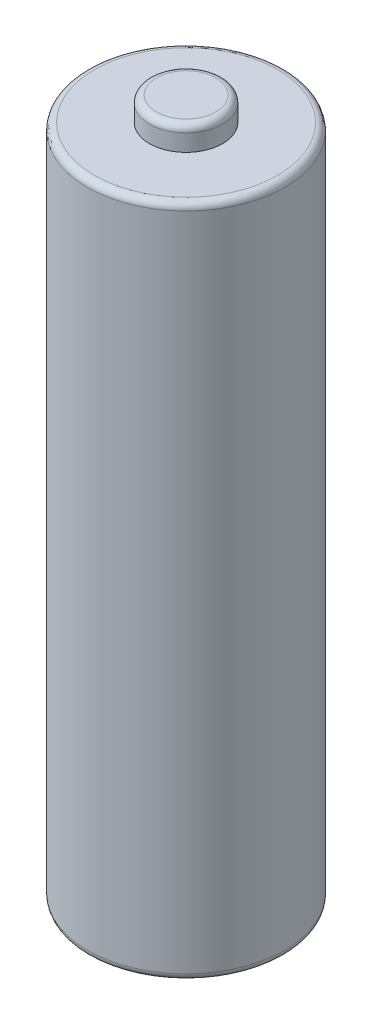
ISO-10303-21;
HEADER;
FILE_DESCRIPTION(('STEP AP214'),'2;1');
FILE_NAME('part.step','',(''),(''),'','','');
FILE_SCHEMA(('AUTOMOTIVE_DESIGN { 1 0 10303 214 1 1 1 1 }'));
ENDSEC;
DATA;
#1=APPLICATION_CONTEXT('core data for automotive mechanical design processes');
#2=APPLICATION_PROTOCOL_DEFINITION('international standard','automotive_design',2000,#1);
#3=PRODUCT_CONTEXT('',#1,'mechanical');
#4=PRODUCT('Part','Part','',(#3));
#5=PRODUCT_RELATED_PRODUCT_CATEGORY('part','',(#4));
#6=PRODUCT_DEFINITION_FORMATION('','',#4);
#7=PRODUCT_DEFINITION_CONTEXT('part definition',#1,'design');
#8=PRODUCT_DEFINITION('design','',#6,#7);
#9=PRODUCT_DEFINITION_SHAPE('','',#8);
#10=(LENGTH_UNIT() NAMED_UNIT(*) SI_UNIT(.MILLI.,.METRE.));
#11=(NAMED_UNIT(*) PLANE_ANGLE_UNIT() SI_UNIT($,.RADIAN.));
#12=(NAMED_UNIT(*) SI_UNIT($,.STERADIAN.) SOLID_ANGLE_UNIT());
#13=UNCERTAINTY_MEASURE_WITH_UNIT(LENGTH_MEASURE(1.E-05),#10,'distance_accuracy_value','');
#14=(GEOMETRIC_REPRESENTATION_CONTEXT(3) GLOBAL_UNCERTAINTY_ASSIGNED_CONTEXT((#13)) GLOBAL_UNIT_ASSIGNED_CONTEXT((#10,
#11,#12)) REPRESENTATION_CONTEXT('',''));
#15=CARTESIAN_POINT('',(0.,0.,0.));
#16=DIRECTION('',(0.,0.,1.));
#17=DIRECTION('',(1.,0.,0.));
#18=AXIS2_PLACEMENT_3D('',#15,#16,#17);
#19=CARTESIAN_POINT('',(0.,48.25,0.));
#20=DIRECTION('',(0.,1.,0.));
#21=DIRECTION('',(0.,0.,1.));
#22=AXIS2_PLACEMENT_3D('',#19,#20,#21);
#23=PLANE('',#22);
#24=CARTESIAN_POINT('',(0.,48.25,0.));
#25=DIRECTION('',(0.,1.,0.));
#26=DIRECTION('',(0.,0.,1.));
#27=AXIS2_PLACEMENT_3D('',#24,#25,#26);
#28=CIRCLE('',#27,6.55);
#29=CARTESIAN_POINT('',(0.,48.25,6.55));
#30=VERTEX_POINT('',#29);
#31=EDGE_CURVE('E10',#30,#30,#28,.T.);
#32=ORIENTED_EDGE('',*,*,#31,.T.);
#33=EDGE_LOOP('',(#32));
#34=FACE_BOUND('',#33,.T.);
#35=CARTESIAN_POINT('',(0.,48.25,0.));
#36=DIRECTION('',(0.,1.,0.));
#37=DIRECTION('',(0.,0.,1.));
#38=AXIS2_PLACEMENT_3D('',#35,#36,#37);
#39=CIRCLE('',#38,2.62);
#40=CARTESIAN_POINT('',(0.,48.25,2.62));
#41=VERTEX_POINT('',#40);
#42=EDGE_CURVE('E57',#41,#41,#39,.T.);
#43=ORIENTED_EDGE('',*,*,#42,.F.);
#44=EDGE_LOOP('',(#43));
#45=FACE_BOUND('',#44,.T.);
#46=ADVANCED_FACE('F31',(#34,#45),#23,.T.);
#47=CARTESIAN_POINT('',(0.,48.25,0.));
#48=DIRECTION('',(0.,-1.,0.));
#49=DIRECTION('',(0.,0.,-1.));
#50=AXIS2_PLACEMENT_3D('',#47,#48,#49);
#51=CYLINDRICAL_SURFACE('',#50,7.05);
#52=CARTESIAN_POINT('',(0.,0.5,0.));
#53=DIRECTION('',(0.,1.,0.));
#54=DIRECTION('',(0.,0.,1.));
#55=AXIS2_PLACEMENT_3D('',#52,#53,#54);
#56=CIRCLE('',#55,7.05);
#57=CARTESIAN_POINT('',(0.,0.5,7.05));
#58=VERTEX_POINT('',#57);
#59=EDGE_CURVE('E42',#58,#58,#56,.T.);
#60=ORIENTED_EDGE('',*,*,#59,.T.);
#61=EDGE_LOOP('',(#60));
#62=FACE_BOUND('',#61,.T.);
#63=CARTESIAN_POINT('',(0.,47.75,0.));
#64=DIRECTION('',(0.,1.,0.));
#65=DIRECTION('',(0.,0.,1.));
#66=AXIS2_PLACEMENT_3D('',#63,#64,#65);
#67=CIRCLE('',#66,7.05);
#68=CARTESIAN_POINT('',(0.,47.75,7.05));
#69=VERTEX_POINT('',#68);
#70=EDGE_CURVE('E46',#69,#69,#67,.F.);
#71=ORIENTED_EDGE('',*,*,#70,.T.);
#72=EDGE_LOOP('',(#71));
#73=FACE_BOUND('',#72,.T.);
#74=ADVANCED_FACE('F64',(#62,#73),#51,.T.);
#75=CARTESIAN_POINT('',(0.,0.,0.));
#76=DIRECTION('',(0.,1.,0.));
#77=DIRECTION('',(0.,0.,1.));
#78=AXIS2_PLACEMENT_3D('',#75,#76,#77);
#79=PLANE('',#78);
#80=CARTESIAN_POINT('',(0.,0.,0.));
#81=DIRECTION('',(0.,1.,0.));
#82=DIRECTION('',(0.,0.,1.));
#83=AXIS2_PLACEMENT_3D('',#80,#81,#82);
#84=CIRCLE('',#83,6.55);
#85=CARTESIAN_POINT('',(0.,0.,6.55));
#86=VERTEX_POINT('',#85);
#87=EDGE_CURVE('E38',#86,#86,#84,.F.);
#88=ORIENTED_EDGE('',*,*,#87,.T.);
#89=EDGE_LOOP('',(#88));
#90=FACE_BOUND('',#89,.T.);
#91=ADVANCED_FACE('F69',(#90),#79,.F.);
#92=CARTESIAN_POINT('',(0.,49.96,0.));
#93=DIRECTION('',(0.,-1.,0.));
#94=DIRECTION('',(0.,0.,-1.));
#95=AXIS2_PLACEMENT_3D('',#92,#93,#94);
#96=CYLINDRICAL_SURFACE('',#95,2.62);
#97=CARTESIAN_POINT('',(0.,49.46,0.));
#98=DIRECTION('',(0.,1.,0.));
#99=DIRECTION('',(0.,0.,1.));
#100=AXIS2_PLACEMENT_3D('',#97,#98,#99);
#101=CIRCLE('',#100,2.62);
#102=CARTESIAN_POINT('',(0.,49.46,2.62));
#103=VERTEX_POINT('',#102);
#104=EDGE_CURVE('E51',#103,#103,#101,.F.);
#105=ORIENTED_EDGE('',*,*,#104,.T.);
#106=EDGE_LOOP('',(#105));
#107=FACE_BOUND('',#106,.T.);
#108=ORIENTED_EDGE('',*,*,#42,.T.);
#109=EDGE_LOOP('',(#108));
#110=FACE_BOUND('',#109,.T.);
#111=ADVANCED_FACE('F61',(#107,#110),#96,.T.);
#112=CARTESIAN_POINT('',(0.,49.96,0.));
#113=DIRECTION('',(0.,1.,0.));
#114=DIRECTION('',(0.,0.,1.));
#115=AXIS2_PLACEMENT_3D('',#112,#113,#114);
#116=PLANE('',#115);
#117=CARTESIAN_POINT('',(0.,49.96,0.));
#118=DIRECTION('',(0.,1.,0.));
#119=DIRECTION('',(0.,0.,1.));
#120=AXIS2_PLACEMENT_3D('',#117,#118,#119);
#121=CIRCLE('',#120,2.12);
#122=CARTESIAN_POINT('',(0.,49.96,2.12));
#123=VERTEX_POINT('',#122);
#124=EDGE_CURVE('E54',#123,#123,#121,.T.);
#125=ORIENTED_EDGE('',*,*,#124,.T.);
#126=EDGE_LOOP('',(#125));
#127=FACE_BOUND('',#126,.T.);
#128=ADVANCED_FACE('F80',(#127),#116,.T.);
#129=CARTESIAN_POINT('',(0.,49.46,0.));
#130=DIRECTION('',(0.,1.,0.));
#131=DIRECTION('',(0.,0.,1.));
#132=AXIS2_PLACEMENT_3D('',#129,#130,#131);
#133=TOROIDAL_SURFACE('',#132,2.12,0.5);
#134=ORIENTED_EDGE('',*,*,#104,.F.);
#135=EDGE_LOOP('',(#134));
#136=FACE_BOUND('',#135,.T.);
#137=ORIENTED_EDGE('',*,*,#124,.F.);
#138=EDGE_LOOP('',(#137));
#139=FACE_BOUND('',#138,.T.);
#140=ADVANCED_FACE('F77',(#136,#139),#133,.T.);
#141=CARTESIAN_POINT('',(0.,0.5,0.));
#142=DIRECTION('',(0.,1.,0.));
#143=DIRECTION('',(0.,0.,1.));
#144=AXIS2_PLACEMENT_3D('',#141,#142,#143);
#145=TOROIDAL_SURFACE('',#144,6.55,0.5);
#146=ORIENTED_EDGE('',*,*,#87,.F.);
#147=EDGE_LOOP('',(#146));
#148=FACE_BOUND('',#147,.T.);
#149=ORIENTED_EDGE('',*,*,#59,.F.);
#150=EDGE_LOOP('',(#149));
#151=FACE_BOUND('',#150,.T.);
#152=ADVANCED_FACE('F79',(#148,#151),#145,.T.);
#153=CARTESIAN_POINT('',(0.,47.75,0.));
#154=DIRECTION('',(0.,1.,0.));
#155=DIRECTION('',(0.,0.,1.));
#156=AXIS2_PLACEMENT_3D('',#153,#154,#155);
#157=TOROIDAL_SURFACE('',#156,6.55,0.5);
#158=ORIENTED_EDGE('',*,*,#70,.F.);
#159=EDGE_LOOP('',(#158));
#160=FACE_BOUND('',#159,.T.);
#161=ORIENTED_EDGE('',*,*,#31,.F.);
#162=EDGE_LOOP('',(#161));
#163=FACE_BOUND('',#162,.T.);
#164=ADVANCED_FACE('F33',(#160,#163),#157,.T.);
#165=CLOSED_SHELL('',(#46,#74,#91,#111,#128,#140,#152,#164));
#166=MANIFOLD_SOLID_BREP('B2',#165);
#167=ADVANCED_BREP_SHAPE_REPRESENTATION('',(#18,#166),#14);
#168=SHAPE_DEFINITION_REPRESENTATION(#9,#167);
ENDSEC;
END-ISO-10303-21;
